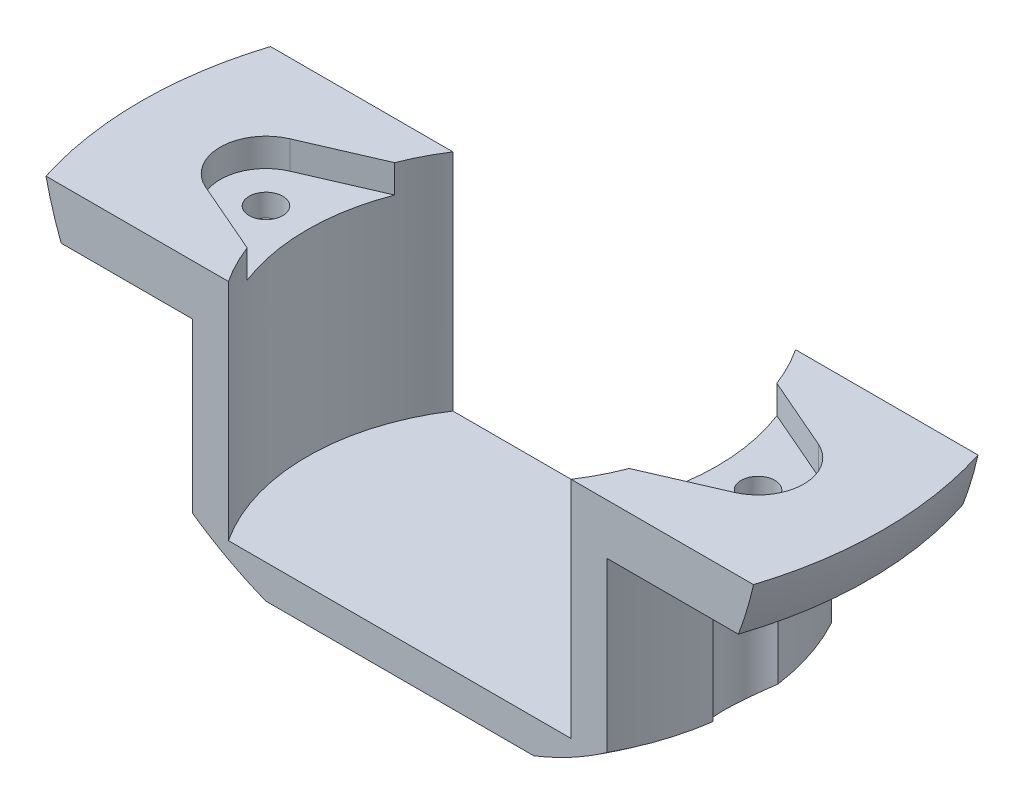
ISO-10303-21;
HEADER;
FILE_DESCRIPTION(('STEP AP214'),'2;1');
FILE_NAME('part.step','',(''),(''),'','','');
FILE_SCHEMA(('AUTOMOTIVE_DESIGN { 1 0 10303 214 1 1 1 1 }'));
ENDSEC;
DATA;
#1=APPLICATION_CONTEXT('core data for automotive mechanical design processes');
#2=APPLICATION_PROTOCOL_DEFINITION('international standard','automotive_design',2000,#1);
#3=PRODUCT_CONTEXT('',#1,'mechanical');
#4=PRODUCT('Part','Part','',(#3));
#5=PRODUCT_RELATED_PRODUCT_CATEGORY('part','',(#4));
#6=PRODUCT_DEFINITION_FORMATION('','',#4);
#7=PRODUCT_DEFINITION_CONTEXT('part definition',#1,'design');
#8=PRODUCT_DEFINITION('design','',#6,#7);
#9=PRODUCT_DEFINITION_SHAPE('','',#8);
#10=(LENGTH_UNIT() NAMED_UNIT(*) SI_UNIT(.MILLI.,.METRE.));
#11=(NAMED_UNIT(*) PLANE_ANGLE_UNIT() SI_UNIT($,.RADIAN.));
#12=(NAMED_UNIT(*) SI_UNIT($,.STERADIAN.) SOLID_ANGLE_UNIT());
#13=UNCERTAINTY_MEASURE_WITH_UNIT(LENGTH_MEASURE(1.E-05),#10,'distance_accuracy_value','');
#14=(GEOMETRIC_REPRESENTATION_CONTEXT(3) GLOBAL_UNCERTAINTY_ASSIGNED_CONTEXT((#13)) GLOBAL_UNIT_ASSIGNED_CONTEXT((#10,
#11,#12)) REPRESENTATION_CONTEXT('',''));
#15=CARTESIAN_POINT('',(0.,0.,0.));
#16=DIRECTION('',(0.,0.,1.));
#17=DIRECTION('',(1.,0.,0.));
#18=AXIS2_PLACEMENT_3D('',#15,#16,#17);
#19=CARTESIAN_POINT('',(0.,0.,0.));
#20=DIRECTION('',(0.,-1.,0.));
#21=DIRECTION('',(-1.,0.,0.));
#22=AXIS2_PLACEMENT_3D('',#19,#20,#21);
#23=SPHERICAL_SURFACE('',#22,33.8);
#24=CARTESIAN_POINT('',(0.,-26.484712571595,0.));
#25=DIRECTION('',(0.,1.,0.));
#26=DIRECTION('',(0.,0.,1.));
#27=AXIS2_PLACEMENT_3D('',#24,#25,#26);
#28=CIRCLE('',#27,21.);
#29=CARTESIAN_POINT('',(-18.4661853126194,-26.484712571595,10.));
#30=VERTEX_POINT('',#29);
#31=CARTESIAN_POINT('',(-20.8001003649635,-26.484712571595,2.89064435852027));
#32=VERTEX_POINT('',#31);
#33=EDGE_CURVE('E250',#30,#32,#28,.F.);
#34=ORIENTED_EDGE('',*,*,#33,.T.);
#35=CARTESIAN_POINT('',(-20.9039277655756,-26.398640244474,-2.92875352572247));
#36=CARTESIAN_POINT('',(-20.8063617033494,-26.4796550416653,-2.89487123831758));
#37=CARTESIAN_POINT('',(-20.7097097703274,-26.5595345143175,-2.85590288108901));
#38=CARTESIAN_POINT('',(-20.5188008915975,-26.7166307495117,-2.76727449327657));
#39=CARTESIAN_POINT('',(-20.4245495979902,-26.7938413579846,-2.71759144580597));
#40=CARTESIAN_POINT('',(-20.1455956378546,-27.0214069258355,-2.55117212351429));
#41=CARTESIAN_POINT('',(-19.9660755167148,-27.1665497162446,-2.4175249198258));
#42=CARTESIAN_POINT('',(-19.6865485623203,-27.3909914672109,-2.15536785942298));
#43=CARTESIAN_POINT('',(-19.5796487527699,-27.4763689077971,-2.03927630164801));
#44=CARTESIAN_POINT('',(-19.3817590168635,-27.633787752233,-1.78686258732234));
#45=CARTESIAN_POINT('',(-19.2907100746102,-27.7058786858668,-1.6506191260265));
#46=CARTESIAN_POINT('',(-19.1411604836875,-27.8239265774458,-1.38133664883738));
#47=CARTESIAN_POINT('',(-19.0798256845994,-27.8721820228791,-1.25088610477296));
#48=CARTESIAN_POINT('',(-18.97493201475,-27.9545539108106,-0.978681457344079));
#49=CARTESIAN_POINT('',(-18.9313759712339,-27.9886681045268,-0.836925560440767));
#50=CARTESIAN_POINT('',(-18.8646099295564,-28.0409094092167,-0.545063564498725));
#51=CARTESIAN_POINT('',(-18.8414972138931,-28.0589600820907,-0.394921116445173));
#52=CARTESIAN_POINT('',(-18.817638579733,-28.0775928367282,-0.0918207940655948));
#53=CARTESIAN_POINT('',(-18.8168822600703,-28.0781830418593,0.0611357378817071));
#54=CARTESIAN_POINT('',(-18.8368296880482,-28.0626055124787,0.351188572414799));
#55=CARTESIAN_POINT('',(-18.8556588949793,-28.047901590033,0.488500252309322));
#56=CARTESIAN_POINT('',(-18.9107953814761,-28.0047779988111,0.757309663218436));
#57=CARTESIAN_POINT('',(-18.947105026385,-27.9763564738535,0.888806604789135));
#58=CARTESIAN_POINT('',(-19.0363186895338,-27.9063690214966,1.14602144212512));
#59=CARTESIAN_POINT('',(-19.0895985229953,-27.8645052170937,1.27152614681683));
#60=CARTESIAN_POINT('',(-19.2099200956857,-27.7696911693222,1.51111038413956));
#61=CARTESIAN_POINT('',(-19.2769613288771,-27.7167413336104,1.62519033665492));
#62=CARTESIAN_POINT('',(-19.432087400059,-27.5938025322857,1.85527600084407));
#63=CARTESIAN_POINT('',(-19.521790448868,-27.5224790857897,1.96947085448558));
#64=CARTESIAN_POINT('',(-19.7124882227067,-27.3701802259617,2.18111118165925));
#65=CARTESIAN_POINT('',(-19.8135092517596,-27.28918229814,2.2785162435795));
#66=CARTESIAN_POINT('',(-20.0704904708395,-27.0821134127888,2.49577066645825));
#67=CARTESIAN_POINT('',(-20.2309445932343,-26.9519854144042,2.60641242709307));
#68=CARTESIAN_POINT('',(-20.5616047593516,-26.6817247526819,2.79294367724959));
#69=CARTESIAN_POINT('',(-20.731751600592,-26.541651759433,2.86902303178351));
#70=CARTESIAN_POINT('',(-20.9039277655756,-26.398640244474,2.92875352572248));
#71=B_SPLINE_CURVE_WITH_KNOTS('',3,(#35,#36,#37,#38,#39,#40,#41,#42,#43,#44,#45,#46,#47,#48,#49,
#50,#51,#52,#53,#54,#55,#56,#57,#58,#59,#60,#61,#62,#63,#64,#65,#66,#67,#68,#69,#70),
.UNSPECIFIED.,.F.,.F.,(4,2,2,2,2,2,2,2,2,2,2,2,2,2,2,2,2,4),(0.,0.393520569795233,
0.787895058794031,1.58213172818714,2.11851906290223,2.65286450258805,3.10700621508109,
3.56122011880086,4.01758401284611,4.47373558325256,4.88991880917637,5.30615836624046,
5.73234465175406,6.1585152682474,6.6420967009325,7.12682629564412,7.82655488459547,
8.52239167338341),.UNSPECIFIED.);
#72=CARTESIAN_POINT('',(-20.8001003649635,-26.484712571595,-2.89064435852028));
#73=VERTEX_POINT('',#72);
#74=EDGE_CURVE('E61',#73,#32,#71,.T.);
#75=ORIENTED_EDGE('',*,*,#74,.F.);
#76=CARTESIAN_POINT('',(-18.4661853126194,-26.484712571595,-10.));
#77=VERTEX_POINT('',#76);
#78=EDGE_CURVE('E230',#73,#77,#28,.F.);
#79=ORIENTED_EDGE('',*,*,#78,.T.);
#80=CARTESIAN_POINT('',(0.,0.,-10.));
#81=DIRECTION('',(0.,0.,-1.));
#82=DIRECTION('',(-1.,0.,0.));
#83=AXIS2_PLACEMENT_3D('',#80,#81,#82);
#84=CIRCLE('',#83,32.2868394241369);
#85=CARTESIAN_POINT('',(-11.9348229982685,-30.,-10.));
#86=VERTEX_POINT('',#85);
#87=EDGE_CURVE('E373',#77,#86,#84,.F.);
#88=ORIENTED_EDGE('',*,*,#87,.T.);
#89=CARTESIAN_POINT('',(0.,-30.,0.));
#90=DIRECTION('',(0.,1.,0.));
#91=DIRECTION('',(0.,0.,1.));
#92=AXIS2_PLACEMENT_3D('',#89,#90,#91);
#93=CIRCLE('',#92,15.5704848993215);
#94=CARTESIAN_POINT('',(-11.9348229982685,-30.,10.));
#95=VERTEX_POINT('',#94);
#96=EDGE_CURVE('E462',#95,#86,#93,.F.);
#97=ORIENTED_EDGE('',*,*,#96,.F.);
#98=CARTESIAN_POINT('',(0.,0.,10.));
#99=DIRECTION('',(0.,0.,1.));
#100=DIRECTION('',(1.,0.,0.));
#101=AXIS2_PLACEMENT_3D('',#98,#99,#100);
#102=CIRCLE('',#101,32.2868394241369);
#103=EDGE_CURVE('E368',#95,#30,#102,.F.);
#104=ORIENTED_EDGE('',*,*,#103,.T.);
#105=EDGE_LOOP('',(#34,#75,#79,#88,#97,#104));
#106=FACE_BOUND('',#105,.T.);
#107=ADVANCED_FACE('F38',(#106),#23,.T.);
#108=CARTESIAN_POINT('',(18.4661853126194,-26.484712571595,-10.));
#109=VERTEX_POINT('',#108);
#110=CARTESIAN_POINT('',(20.8001003649635,-26.484712571595,-2.89064435852029));
#111=VERTEX_POINT('',#110);
#112=EDGE_CURVE('E244',#109,#111,#28,.F.);
#113=ORIENTED_EDGE('',*,*,#112,.T.);
#114=CARTESIAN_POINT('',(20.9212849788197,-26.3842238189518,2.93471775584446));
#115=CARTESIAN_POINT('',(20.8236306011507,-26.4653562466392,2.90145175367052));
#116=CARTESIAN_POINT('',(20.7268671205073,-26.5453709674286,2.86310834780955));
#117=CARTESIAN_POINT('',(20.5356833862506,-26.702776151722,2.77575274688592));
#118=CARTESIAN_POINT('',(20.4412685796781,-26.7801606442884,2.7267179366121));
#119=CARTESIAN_POINT('',(20.1617225127619,-27.0083237624712,2.56228573988936));
#120=CARTESIAN_POINT('',(19.9816771180288,-27.153961408035,2.43001259441059));
#121=CARTESIAN_POINT('',(19.7004592017507,-27.379859765143,2.16971749934803));
#122=CARTESIAN_POINT('',(19.5925463697271,-27.4660800402281,2.05401708145196));
#123=CARTESIAN_POINT('',(19.3925798079542,-27.6252054510541,1.80217289227169));
#124=CARTESIAN_POINT('',(19.3004674561961,-27.6981598683244,1.66610835690374));
#125=CARTESIAN_POINT('',(19.1490505629728,-27.8177112602333,1.39711520839565));
#126=CARTESIAN_POINT('',(19.0868902013585,-27.8666265918021,1.26683156026589));
#127=CARTESIAN_POINT('',(18.9803215951353,-27.9503284466821,0.994786521771566));
#128=CARTESIAN_POINT('',(18.9359160709322,-27.9851128048508,0.853023376510676));
#129=CARTESIAN_POINT('',(18.8674683409806,-28.0386754901301,0.56093299923373));
#130=CARTESIAN_POINT('',(18.8435257131442,-28.0573755495345,0.410567645110321));
#131=CARTESIAN_POINT('',(18.8181006225993,-28.0772323396609,0.106828617014755));
#132=CARTESIAN_POINT('',(18.8166073470225,-28.0783975161671,-0.0465435730493309));
#133=CARTESIAN_POINT('',(18.8352691953377,-28.0638242773378,-0.337262902998077));
#134=CARTESIAN_POINT('',(18.8535008015624,-28.0495877974034,-0.47481683100432));
#135=CARTESIAN_POINT('',(18.9075223393941,-28.0073394377885,-0.744215715177445));
#136=CARTESIAN_POINT('',(18.9433145850548,-27.9793257426139,-0.87605991645242));
#137=CARTESIAN_POINT('',(19.0314826980442,-27.910166779017,-1.1337674965136));
#138=CARTESIAN_POINT('',(19.084201822893,-27.8687495508944,-1.25943881486395));
#139=CARTESIAN_POINT('',(19.2034484086963,-27.7747983926455,-1.49943995171104));
#140=CARTESIAN_POINT('',(19.2699750531608,-27.7222651198489,-1.61377044024279));
#141=CARTESIAN_POINT('',(19.423951383369,-27.6002635919525,-1.84429647599987));
#142=CARTESIAN_POINT('',(19.5130077259752,-27.5294716188944,-1.95871161745582));
#143=CARTESIAN_POINT('',(19.702460100221,-27.3782089118188,-2.17090124292018));
#144=CARTESIAN_POINT('',(19.8028833471268,-27.2977149175057,-2.26863432167143));
#145=CARTESIAN_POINT('',(20.0632584126155,-27.0879803189108,-2.49088300263681));
#146=CARTESIAN_POINT('',(20.2282928058839,-26.95416095744,-2.60510106860825));
#147=CARTESIAN_POINT('',(20.5686805005068,-26.6759329550891,-2.79674958144599));
#148=CARTESIAN_POINT('',(20.7439702868011,-26.5315883607771,-2.87438407174586));
#149=CARTESIAN_POINT('',(20.9212849788197,-26.3842238189518,-2.93471775584448));
#150=B_SPLINE_CURVE_WITH_KNOTS('',3,(#114,#115,#116,#117,#118,#119,#120,#121,#122,#123,#124,
#125,#126,#127,#128,#129,#130,#131,#132,#133,#134,#135,#136,#137,#138,#139,#140,#141,#142,#143,
#144,#145,#146,#147,#148,#149),.UNSPECIFIED.,.F.,.F.,(4,2,2,2,2,2,2,2,2,2,2,2,2,2,2,2,2,4),(0.,
0.393464759109579,0.787770019586551,1.58188290270471,2.12052892627023,2.65713111483241,
3.11247935855384,3.56789734426839,4.02551909800542,4.48292042834849,4.89942824961454,
5.31599097095659,5.74159995311048,6.16718377458476,6.64946060936992,7.13291758881426,
7.8529547084684,8.56892687376756),.UNSPECIFIED.);
#151=CARTESIAN_POINT('',(20.8001003649635,-26.484712571595,2.89064435852028));
#152=VERTEX_POINT('',#151);
#153=EDGE_CURVE('E470',#152,#111,#150,.T.);
#154=ORIENTED_EDGE('',*,*,#153,.F.);
#155=CARTESIAN_POINT('',(18.4661853126194,-26.484712571595,10.));
#156=VERTEX_POINT('',#155);
#157=EDGE_CURVE('E249',#152,#156,#28,.F.);
#158=ORIENTED_EDGE('',*,*,#157,.T.);
#159=CARTESIAN_POINT('',(11.9348229982685,-30.,10.));
#160=VERTEX_POINT('',#159);
#161=EDGE_CURVE('E367',#156,#160,#102,.F.);
#162=ORIENTED_EDGE('',*,*,#161,.T.);
#163=CARTESIAN_POINT('',(11.9348229982685,-30.,-10.));
#164=VERTEX_POINT('',#163);
#165=EDGE_CURVE('E454',#164,#160,#93,.F.);
#166=ORIENTED_EDGE('',*,*,#165,.F.);
#167=EDGE_CURVE('E374',#164,#109,#84,.F.);
#168=ORIENTED_EDGE('',*,*,#167,.T.);
#169=EDGE_LOOP('',(#113,#154,#158,#162,#166,#168));
#170=FACE_BOUND('',#169,.T.);
#171=ADVANCED_FACE('F412',(#170),#23,.T.);
#172=CARTESIAN_POINT('',(-21.92,-27.,0.));
#173=DIRECTION('',(0.,1.,0.));
#174=DIRECTION('',(0.,0.,1.));
#175=AXIS2_PLACEMENT_3D('',#172,#173,#174);
#176=CYLINDRICAL_SURFACE('',#175,1.5);
#177=CARTESIAN_POINT('',(-21.92,-9.5,0.));
#178=DIRECTION('',(0.,1.,0.));
#179=DIRECTION('',(0.,0.,1.));
#180=AXIS2_PLACEMENT_3D('',#177,#178,#179);
#181=CIRCLE('',#180,1.5);
#182=CARTESIAN_POINT('',(-21.92,-9.5,1.5));
#183=VERTEX_POINT('',#182);
#184=EDGE_CURVE('E282',#183,#183,#181,.T.);
#185=ORIENTED_EDGE('',*,*,#184,.T.);
#186=EDGE_LOOP('',(#185));
#187=FACE_BOUND('',#186,.T.);
#188=CARTESIAN_POINT('',(-21.92,-11.5,0.));
#189=DIRECTION('',(0.,1.,0.));
#190=DIRECTION('',(0.,0.,1.));
#191=AXIS2_PLACEMENT_3D('',#188,#189,#190);
#192=CIRCLE('',#191,1.5);
#193=CARTESIAN_POINT('',(-21.92,-11.5,1.5));
#194=VERTEX_POINT('',#193);
#195=EDGE_CURVE('E267',#194,#194,#192,.F.);
#196=ORIENTED_EDGE('',*,*,#195,.T.);
#197=EDGE_LOOP('',(#196));
#198=FACE_BOUND('',#197,.T.);
#199=ADVANCED_FACE('F416',(#187,#198),#176,.F.);
#200=CARTESIAN_POINT('',(21.92,-27.,0.));
#201=DIRECTION('',(0.,1.,0.));
#202=DIRECTION('',(0.,0.,1.));
#203=AXIS2_PLACEMENT_3D('',#200,#201,#202);
#204=CYLINDRICAL_SURFACE('',#203,1.5);
#205=CARTESIAN_POINT('',(21.92,-9.5,0.));
#206=DIRECTION('',(0.,1.,0.));
#207=DIRECTION('',(0.,0.,1.));
#208=AXIS2_PLACEMENT_3D('',#205,#206,#207);
#209=CIRCLE('',#208,1.5);
#210=CARTESIAN_POINT('',(21.92,-9.5,1.49999999999999));
#211=VERTEX_POINT('',#210);
#212=EDGE_CURVE('E286',#211,#211,#209,.T.);
#213=ORIENTED_EDGE('',*,*,#212,.T.);
#214=EDGE_LOOP('',(#213));
#215=FACE_BOUND('',#214,.T.);
#216=CARTESIAN_POINT('',(21.92,-11.5,0.));
#217=DIRECTION('',(0.,1.,0.));
#218=DIRECTION('',(0.,0.,1.));
#219=AXIS2_PLACEMENT_3D('',#216,#217,#218);
#220=CIRCLE('',#219,1.5);
#221=CARTESIAN_POINT('',(21.92,-11.5,1.49999999999999));
#222=VERTEX_POINT('',#221);
#223=EDGE_CURVE('E46',#222,#222,#220,.F.);
#224=ORIENTED_EDGE('',*,*,#223,.T.);
#225=EDGE_LOOP('',(#224));
#226=FACE_BOUND('',#225,.T.);
#227=ADVANCED_FACE('F395',(#215,#226),#204,.F.);
#228=CARTESIAN_POINT('',(0.,-33.8,0.));
#229=DIRECTION('',(0.,1.,0.));
#230=DIRECTION('',(0.,0.,1.));
#231=AXIS2_PLACEMENT_3D('',#228,#229,#230);
#232=CYLINDRICAL_SURFACE('',#231,21.);
#233=ORIENTED_EDGE('',*,*,#157,.F.);
#234=DIRECTION('',(0.,1.,0.));
#235=VECTOR('',#234,1.);
#236=CARTESIAN_POINT('',(20.8001003649635,-18.9923562857975,2.89064435852027));
#237=LINE('',#236,#235);
#238=CARTESIAN_POINT('',(20.8001003649635,-11.5,2.89064435852027));
#239=VERTEX_POINT('',#238);
#240=EDGE_CURVE('E466',#239,#152,#237,.F.);
#241=ORIENTED_EDGE('',*,*,#240,.F.);
#242=CARTESIAN_POINT('',(0.,-11.5,0.));
#243=DIRECTION('',(0.,1.,0.));
#244=DIRECTION('',(0.,0.,1.));
#245=AXIS2_PLACEMENT_3D('',#242,#243,#244);
#246=CIRCLE('',#245,21.);
#247=CARTESIAN_POINT('',(18.4661853126194,-11.5,10.));
#248=VERTEX_POINT('',#247);
#249=EDGE_CURVE('E239',#248,#239,#246,.T.);
#250=ORIENTED_EDGE('',*,*,#249,.F.);
#251=DIRECTION('',(0.,1.,0.));
#252=VECTOR('',#251,1.);
#253=CARTESIAN_POINT('',(18.4661853126194,-33.8,10.));
#254=LINE('',#253,#252);
#255=EDGE_CURVE('E256',#156,#248,#254,.T.);
#256=ORIENTED_EDGE('',*,*,#255,.F.);
#257=EDGE_LOOP('',(#233,#241,#250,#256));
#258=FACE_BOUND('',#257,.T.);
#259=ADVANCED_FACE('F441',(#258),#232,.T.);
#260=CARTESIAN_POINT('',(20.8001003649635,-11.5,-2.89064435852028));
#261=VERTEX_POINT('',#260);
#262=CARTESIAN_POINT('',(18.4661853126194,-11.5,-10.));
#263=VERTEX_POINT('',#262);
#264=EDGE_CURVE('E236',#261,#263,#246,.T.);
#265=ORIENTED_EDGE('',*,*,#264,.F.);
#266=DIRECTION('',(0.,1.,0.));
#267=VECTOR('',#266,1.);
#268=CARTESIAN_POINT('',(20.8001003649635,-18.9923562857975,-2.89064435852029));
#269=LINE('',#268,#267);
#270=EDGE_CURVE('E53',#111,#261,#269,.T.);
#271=ORIENTED_EDGE('',*,*,#270,.F.);
#272=ORIENTED_EDGE('',*,*,#112,.F.);
#273=DIRECTION('',(0.,1.,0.));
#274=VECTOR('',#273,1.);
#275=CARTESIAN_POINT('',(18.4661853126194,-33.8,-10.));
#276=LINE('',#275,#274);
#277=EDGE_CURVE('E248',#263,#109,#276,.F.);
#278=ORIENTED_EDGE('',*,*,#277,.F.);
#279=EDGE_LOOP('',(#265,#271,#272,#278));
#280=FACE_BOUND('',#279,.T.);
#281=ADVANCED_FACE('F490',(#280),#232,.T.);
#282=ORIENTED_EDGE('',*,*,#78,.F.);
#283=DIRECTION('',(0.,1.,0.));
#284=VECTOR('',#283,1.);
#285=CARTESIAN_POINT('',(-20.8001003649635,-18.9923562857975,-2.89064435852028));
#286=LINE('',#285,#284);
#287=CARTESIAN_POINT('',(-20.8001003649635,-11.5,-2.89064435852028));
#288=VERTEX_POINT('',#287);
#289=EDGE_CURVE('E217',#288,#73,#286,.F.);
#290=ORIENTED_EDGE('',*,*,#289,.F.);
#291=CARTESIAN_POINT('',(-18.4661853126194,-11.5,-10.));
#292=VERTEX_POINT('',#291);
#293=EDGE_CURVE('E228',#292,#288,#246,.T.);
#294=ORIENTED_EDGE('',*,*,#293,.F.);
#295=DIRECTION('',(0.,1.,0.));
#296=VECTOR('',#295,1.);
#297=CARTESIAN_POINT('',(-18.4661853126194,-33.8,-10.));
#298=LINE('',#297,#296);
#299=EDGE_CURVE('E265',#77,#292,#298,.T.);
#300=ORIENTED_EDGE('',*,*,#299,.F.);
#301=EDGE_LOOP('',(#282,#290,#294,#300));
#302=FACE_BOUND('',#301,.T.);
#303=ADVANCED_FACE('F226',(#302),#232,.T.);
#304=CARTESIAN_POINT('',(-20.8001003649635,-11.5,2.89064435852028));
#305=VERTEX_POINT('',#304);
#306=CARTESIAN_POINT('',(-18.4661853126194,-11.5,10.));
#307=VERTEX_POINT('',#306);
#308=EDGE_CURVE('E237',#305,#307,#246,.T.);
#309=ORIENTED_EDGE('',*,*,#308,.F.);
#310=DIRECTION('',(0.,1.,0.));
#311=VECTOR('',#310,1.);
#312=CARTESIAN_POINT('',(-20.8001003649635,-18.9923562857975,2.89064435852028));
#313=LINE('',#312,#311);
#314=EDGE_CURVE('E218',#32,#305,#313,.T.);
#315=ORIENTED_EDGE('',*,*,#314,.F.);
#316=ORIENTED_EDGE('',*,*,#33,.F.);
#317=DIRECTION('',(0.,1.,0.));
#318=VECTOR('',#317,1.);
#319=CARTESIAN_POINT('',(-18.4661853126194,-33.8,10.));
#320=LINE('',#319,#318);
#321=EDGE_CURVE('E258',#307,#30,#320,.F.);
#322=ORIENTED_EDGE('',*,*,#321,.F.);
#323=EDGE_LOOP('',(#309,#315,#316,#322));
#324=FACE_BOUND('',#323,.T.);
#325=ADVANCED_FACE('F432',(#324),#232,.T.);
#326=CARTESIAN_POINT('',(0.,-11.5,0.));
#327=DIRECTION('',(0.,1.,0.));
#328=DIRECTION('',(0.,0.,1.));
#329=AXIS2_PLACEMENT_3D('',#326,#327,#328);
#330=CIRCLE('',#329,31.7834862782546);
#331=CARTESIAN_POINT('',(-30.1693553129662,-11.5,10.));
#332=VERTEX_POINT('',#331);
#333=CARTESIAN_POINT('',(-30.1693553129662,-11.5,-10.));
#334=VERTEX_POINT('',#333);
#335=EDGE_CURVE('E279',#332,#334,#330,.F.);
#336=ORIENTED_EDGE('',*,*,#335,.F.);
#337=CARTESIAN_POINT('',(-31.518883228947,-7.,10.));
#338=VERTEX_POINT('',#337);
#339=EDGE_CURVE('E339',#332,#338,#102,.F.);
#340=ORIENTED_EDGE('',*,*,#339,.T.);
#341=CARTESIAN_POINT('',(0.,-7.,0.));
#342=DIRECTION('',(0.,1.,0.));
#343=DIRECTION('',(0.,0.,1.));
#344=AXIS2_PLACEMENT_3D('',#341,#342,#343);
#345=CIRCLE('',#344,33.0672042967046);
#346=CARTESIAN_POINT('',(-33.0672042967046,-7.,0.));
#347=VERTEX_POINT('',#346);
#348=EDGE_CURVE('E375',#338,#347,#345,.F.);
#349=ORIENTED_EDGE('',*,*,#348,.T.);
#350=CARTESIAN_POINT('',(-31.5188832289471,-7.,-10.));
#351=VERTEX_POINT('',#350);
#352=EDGE_CURVE('E379',#347,#351,#345,.F.);
#353=ORIENTED_EDGE('',*,*,#352,.T.);
#354=EDGE_CURVE('E369',#351,#334,#84,.F.);
#355=ORIENTED_EDGE('',*,*,#354,.T.);
#356=EDGE_LOOP('',(#336,#340,#349,#353,#355));
#357=FACE_BOUND('',#356,.T.);
#358=ADVANCED_FACE('F417',(#357),#23,.T.);
#359=CARTESIAN_POINT('',(0.,-9.5,0.));
#360=DIRECTION('',(0.,1.,0.));
#361=DIRECTION('',(0.,0.,1.));
#362=AXIS2_PLACEMENT_3D('',#359,#360,#361);
#363=PLANE('',#362);
#364=ORIENTED_EDGE('',*,*,#212,.F.);
#365=EDGE_LOOP('',(#364));
#366=FACE_BOUND('',#365,.T.);
#367=CARTESIAN_POINT('',(0.,-9.5,0.));
#368=DIRECTION('',(0.,1.,0.));
#369=DIRECTION('',(0.,0.,1.));
#370=AXIS2_PLACEMENT_3D('',#367,#368,#369);
#371=CIRCLE('',#370,18.25);
#372=CARTESIAN_POINT('',(17.0257322293628,-9.5,6.57167726338077));
#373=VERTEX_POINT('',#372);
#374=CARTESIAN_POINT('',(17.0257322293628,-9.5,-6.57167726338076));
#375=VERTEX_POINT('',#374);
#376=EDGE_CURVE('E389',#373,#375,#371,.T.);
#377=ORIENTED_EDGE('',*,*,#376,.F.);
#378=DIRECTION('',(-0.917338230246221,0.,0.398108743095064));
#379=VECTOR('',#378,1.);
#380=CARTESIAN_POINT('',(5.09839699535365,-9.5,11.7479320862179));
#381=LINE('',#380,#379);
#382=CARTESIAN_POINT('',(23.5442836718279,-9.5,3.74273997940458));
#383=VERTEX_POINT('',#382);
#384=EDGE_CURVE('E296',#383,#373,#381,.T.);
#385=ORIENTED_EDGE('',*,*,#384,.F.);
#386=CARTESIAN_POINT('',(21.92,-9.5,0.));
#387=DIRECTION('',(0.,1.,0.));
#388=DIRECTION('',(0.,0.,1.));
#389=AXIS2_PLACEMENT_3D('',#386,#387,#388);
#390=CIRCLE('',#389,4.08);
#391=CARTESIAN_POINT('',(23.5442836718279,-9.5,-3.74273997940458));
#392=VERTEX_POINT('',#391);
#393=EDGE_CURVE('E299',#392,#383,#390,.F.);
#394=ORIENTED_EDGE('',*,*,#393,.F.);
#395=DIRECTION('',(0.917338230246221,0.,0.398108743095064));
#396=VECTOR('',#395,1.);
#397=CARTESIAN_POINT('',(5.09839699535365,-9.5,-11.7479320862179));
#398=LINE('',#397,#396);
#399=EDGE_CURVE('E302',#375,#392,#398,.T.);
#400=ORIENTED_EDGE('',*,*,#399,.F.);
#401=EDGE_LOOP('',(#377,#385,#394,#400));
#402=FACE_BOUND('',#401,.T.);
#403=ADVANCED_FACE('F428',(#366,#402),#363,.T.);
#404=CARTESIAN_POINT('',(0.,-7.,0.));
#405=DIRECTION('',(0.,1.,0.));
#406=DIRECTION('',(0.,0.,1.));
#407=AXIS2_PLACEMENT_3D('',#404,#405,#406);
#408=PLANE('',#407);
#409=CARTESIAN_POINT('',(0.,-7.,0.));
#410=DIRECTION('',(0.,1.,0.));
#411=DIRECTION('',(0.,0.,1.));
#412=AXIS2_PLACEMENT_3D('',#409,#410,#411);
#413=CIRCLE('',#412,18.25);
#414=CARTESIAN_POINT('',(-17.0257322293628,-7.,6.57167726338077));
#415=VERTEX_POINT('',#414);
#416=CARTESIAN_POINT('',(-15.266384640772,-7.,10.));
#417=VERTEX_POINT('',#416);
#418=EDGE_CURVE('E300',#415,#417,#413,.T.);
#419=ORIENTED_EDGE('',*,*,#418,.F.);
#420=DIRECTION('',(0.917338230246221,0.,0.398108743095064));
#421=VECTOR('',#420,1.);
#422=CARTESIAN_POINT('',(-5.09839699535365,-7.,11.7479320862179));
#423=LINE('',#422,#421);
#424=CARTESIAN_POINT('',(-23.5442836718279,-7.,3.74273997940458));
#425=VERTEX_POINT('',#424);
#426=EDGE_CURVE('E334',#425,#415,#423,.T.);
#427=ORIENTED_EDGE('',*,*,#426,.F.);
#428=CARTESIAN_POINT('',(-21.92,-7.,0.));
#429=DIRECTION('',(0.,1.,0.));
#430=DIRECTION('',(0.,0.,1.));
#431=AXIS2_PLACEMENT_3D('',#428,#429,#430);
#432=CIRCLE('',#431,4.08);
#433=CARTESIAN_POINT('',(-23.5442836718279,-7.,-3.74273997940458));
#434=VERTEX_POINT('',#433);
#435=EDGE_CURVE('E331',#434,#425,#432,.T.);
#436=ORIENTED_EDGE('',*,*,#435,.F.);
#437=DIRECTION('',(0.917338230246221,0.,-0.398108743095064));
#438=VECTOR('',#437,1.);
#439=CARTESIAN_POINT('',(-5.09839699535365,-7.,-11.7479320862179));
#440=LINE('',#439,#438);
#441=CARTESIAN_POINT('',(-17.0257322293628,-7.,-6.57167726338077));
#442=VERTEX_POINT('',#441);
#443=EDGE_CURVE('E328',#434,#442,#440,.T.);
#444=ORIENTED_EDGE('',*,*,#443,.T.);
#445=CARTESIAN_POINT('',(0.,-7.,0.));
#446=DIRECTION('',(0.,1.,0.));
#447=DIRECTION('',(0.,0.,1.));
#448=AXIS2_PLACEMENT_3D('',#445,#446,#447);
#449=CIRCLE('',#448,18.25);
#450=CARTESIAN_POINT('',(-15.266384640772,-7.,-10.));
#451=VERTEX_POINT('',#450);
#452=EDGE_CURVE('E327',#451,#442,#449,.T.);
#453=ORIENTED_EDGE('',*,*,#452,.F.);
#454=DIRECTION('',(-1.,0.,0.));
#455=VECTOR('',#454,1.);
#456=CARTESIAN_POINT('',(0.,-7.,-10.));
#457=LINE('',#456,#455);
#458=EDGE_CURVE('E383',#451,#351,#457,.T.);
#459=ORIENTED_EDGE('',*,*,#458,.T.);
#460=ORIENTED_EDGE('',*,*,#352,.F.);
#461=ORIENTED_EDGE('',*,*,#348,.F.);
#462=DIRECTION('',(1.,0.,0.));
#463=VECTOR('',#462,1.);
#464=CARTESIAN_POINT('',(0.,-7.,10.));
#465=LINE('',#464,#463);
#466=EDGE_CURVE('E380',#338,#417,#465,.T.);
#467=ORIENTED_EDGE('',*,*,#466,.T.);
#468=EDGE_LOOP('',(#419,#427,#436,#444,#453,#459,#460,#461,#467));
#469=FACE_BOUND('',#468,.T.);
#470=ADVANCED_FACE('F420',(#469),#408,.T.);
#471=CARTESIAN_POINT('',(30.1693553129662,-11.5,-10.));
#472=VERTEX_POINT('',#471);
#473=CARTESIAN_POINT('',(30.1693553129662,-11.5,10.));
#474=VERTEX_POINT('',#473);
#475=EDGE_CURVE('E276',#472,#474,#330,.F.);
#476=ORIENTED_EDGE('',*,*,#475,.F.);
#477=CARTESIAN_POINT('',(31.5188832289471,-7.,-10.));
#478=VERTEX_POINT('',#477);
#479=EDGE_CURVE('E366',#472,#478,#84,.F.);
#480=ORIENTED_EDGE('',*,*,#479,.T.);
#481=CARTESIAN_POINT('',(33.0672042967046,-7.,0.));
#482=VERTEX_POINT('',#481);
#483=EDGE_CURVE('E543',#478,#482,#345,.F.);
#484=ORIENTED_EDGE('',*,*,#483,.T.);
#485=CARTESIAN_POINT('',(31.5188832289471,-7.,10.));
#486=VERTEX_POINT('',#485);
#487=EDGE_CURVE('E372',#482,#486,#345,.F.);
#488=ORIENTED_EDGE('',*,*,#487,.T.);
#489=EDGE_CURVE('E363',#486,#474,#102,.F.);
#490=ORIENTED_EDGE('',*,*,#489,.T.);
#491=EDGE_LOOP('',(#476,#480,#484,#488,#490));
#492=FACE_BOUND('',#491,.T.);
#493=ADVANCED_FACE('F40',(#492),#23,.T.);
#494=CARTESIAN_POINT('',(15.266384640772,-7.,10.));
#495=VERTEX_POINT('',#494);
#496=CARTESIAN_POINT('',(17.0257322293628,-7.,6.57167726338077));
#497=VERTEX_POINT('',#496);
#498=EDGE_CURVE('E295',#495,#497,#413,.T.);
#499=ORIENTED_EDGE('',*,*,#498,.F.);
#500=EDGE_CURVE('E378',#495,#486,#465,.T.);
#501=ORIENTED_EDGE('',*,*,#500,.T.);
#502=ORIENTED_EDGE('',*,*,#487,.F.);
#503=ORIENTED_EDGE('',*,*,#483,.F.);
#504=CARTESIAN_POINT('',(15.266384640772,-7.,-10.));
#505=VERTEX_POINT('',#504);
#506=EDGE_CURVE('E384',#478,#505,#457,.T.);
#507=ORIENTED_EDGE('',*,*,#506,.T.);
#508=CARTESIAN_POINT('',(17.0257322293628,-7.,-6.57167726338076));
#509=VERTEX_POINT('',#508);
#510=EDGE_CURVE('E325',#509,#505,#449,.T.);
#511=ORIENTED_EDGE('',*,*,#510,.F.);
#512=DIRECTION('',(0.917338230246221,0.,0.398108743095064));
#513=VECTOR('',#512,1.);
#514=CARTESIAN_POINT('',(5.09839699535365,-7.,-11.7479320862179));
#515=LINE('',#514,#513);
#516=CARTESIAN_POINT('',(23.5442836718279,-7.,-3.74273997940458));
#517=VERTEX_POINT('',#516);
#518=EDGE_CURVE('E322',#509,#517,#515,.T.);
#519=ORIENTED_EDGE('',*,*,#518,.T.);
#520=CARTESIAN_POINT('',(21.92,-7.,0.));
#521=DIRECTION('',(0.,1.,0.));
#522=DIRECTION('',(0.,0.,1.));
#523=AXIS2_PLACEMENT_3D('',#520,#521,#522);
#524=CIRCLE('',#523,4.08);
#525=CARTESIAN_POINT('',(23.5442836718279,-7.,3.74273997940458));
#526=VERTEX_POINT('',#525);
#527=EDGE_CURVE('E319',#517,#526,#524,.F.);
#528=ORIENTED_EDGE('',*,*,#527,.T.);
#529=DIRECTION('',(-0.917338230246221,0.,0.398108743095064));
#530=VECTOR('',#529,1.);
#531=CARTESIAN_POINT('',(5.09839699535365,-7.,11.7479320862179));
#532=LINE('',#531,#530);
#533=EDGE_CURVE('E316',#526,#497,#532,.T.);
#534=ORIENTED_EDGE('',*,*,#533,.T.);
#535=EDGE_LOOP('',(#499,#501,#502,#503,#507,#511,#519,#528,#534));
#536=FACE_BOUND('',#535,.T.);
#537=ADVANCED_FACE('F419',(#536),#408,.T.);
#538=CARTESIAN_POINT('',(33.0672042967046,-33.8,10.));
#539=DIRECTION('',(0.,0.,1.));
#540=DIRECTION('',(1.,0.,0.));
#541=AXIS2_PLACEMENT_3D('',#538,#539,#540);
#542=PLANE('',#541);
#543=DIRECTION('',(-1.,0.,0.));
#544=VECTOR('',#543,1.);
#545=CARTESIAN_POINT('',(33.0672042967046,-30.,10.));
#546=LINE('',#545,#544);
#547=EDGE_CURVE('E240',#160,#95,#546,.T.);
#548=ORIENTED_EDGE('',*,*,#547,.F.);
#549=ORIENTED_EDGE('',*,*,#161,.F.);
#550=ORIENTED_EDGE('',*,*,#255,.T.);
#551=DIRECTION('',(-1.,0.,0.));
#552=VECTOR('',#551,1.);
#553=CARTESIAN_POINT('',(33.0672042967046,-11.5,10.));
#554=LINE('',#553,#552);
#555=EDGE_CURVE('E278',#474,#248,#554,.T.);
#556=ORIENTED_EDGE('',*,*,#555,.F.);
#557=ORIENTED_EDGE('',*,*,#489,.F.);
#558=ORIENTED_EDGE('',*,*,#500,.F.);
#559=DIRECTION('',(0.,1.,0.));
#560=VECTOR('',#559,1.);
#561=CARTESIAN_POINT('',(15.266384640772,-9.5,10.));
#562=LINE('',#561,#560);
#563=CARTESIAN_POINT('',(15.266384640772,-27.,10.));
#564=VERTEX_POINT('',#563);
#565=EDGE_CURVE('E337',#564,#495,#562,.T.);
#566=ORIENTED_EDGE('',*,*,#565,.F.);
#567=DIRECTION('',(-1.,0.,0.));
#568=VECTOR('',#567,1.);
#569=CARTESIAN_POINT('',(33.0672042967046,-27.,10.));
#570=LINE('',#569,#568);
#571=CARTESIAN_POINT('',(-15.266384640772,-27.,10.));
#572=VERTEX_POINT('',#571);
#573=EDGE_CURVE('E292',#564,#572,#570,.T.);
#574=ORIENTED_EDGE('',*,*,#573,.T.);
#575=DIRECTION('',(0.,1.,0.));
#576=VECTOR('',#575,1.);
#577=CARTESIAN_POINT('',(-15.266384640772,-9.5,10.));
#578=LINE('',#577,#576);
#579=EDGE_CURVE('E340',#572,#417,#578,.T.);
#580=ORIENTED_EDGE('',*,*,#579,.T.);
#581=ORIENTED_EDGE('',*,*,#466,.F.);
#582=ORIENTED_EDGE('',*,*,#339,.F.);
#583=EDGE_CURVE('E281',#307,#332,#554,.T.);
#584=ORIENTED_EDGE('',*,*,#583,.F.);
#585=ORIENTED_EDGE('',*,*,#321,.T.);
#586=ORIENTED_EDGE('',*,*,#103,.F.);
#587=EDGE_LOOP('',(#548,#549,#550,#556,#557,#558,#566,#574,#580,#581,#582,#584,#585,#586));
#588=FACE_BOUND('',#587,.T.);
#589=ADVANCED_FACE('F426',(#588),#542,.T.);
#590=CARTESIAN_POINT('',(33.0672042967046,-33.8,-10.));
#591=DIRECTION('',(0.,0.,-1.));
#592=DIRECTION('',(-1.,0.,0.));
#593=AXIS2_PLACEMENT_3D('',#590,#591,#592);
#594=PLANE('',#593);
#595=DIRECTION('',(1.,0.,0.));
#596=VECTOR('',#595,1.);
#597=CARTESIAN_POINT('',(33.0672042967046,-30.,-10.));
#598=LINE('',#597,#596);
#599=EDGE_CURVE('E12',#86,#164,#598,.T.);
#600=ORIENTED_EDGE('',*,*,#599,.F.);
#601=ORIENTED_EDGE('',*,*,#87,.F.);
#602=ORIENTED_EDGE('',*,*,#299,.T.);
#603=DIRECTION('',(1.,0.,0.));
#604=VECTOR('',#603,1.);
#605=CARTESIAN_POINT('',(33.0672042967046,-11.5,-10.));
#606=LINE('',#605,#604);
#607=EDGE_CURVE('E235',#334,#292,#606,.T.);
#608=ORIENTED_EDGE('',*,*,#607,.F.);
#609=ORIENTED_EDGE('',*,*,#354,.F.);
#610=ORIENTED_EDGE('',*,*,#458,.F.);
#611=DIRECTION('',(0.,1.,0.));
#612=VECTOR('',#611,1.);
#613=CARTESIAN_POINT('',(-15.266384640772,-9.5,-10.));
#614=LINE('',#613,#612);
#615=CARTESIAN_POINT('',(-15.266384640772,-27.,-10.));
#616=VERTEX_POINT('',#615);
#617=EDGE_CURVE('E351',#616,#451,#614,.T.);
#618=ORIENTED_EDGE('',*,*,#617,.F.);
#619=DIRECTION('',(1.,0.,0.));
#620=VECTOR('',#619,1.);
#621=CARTESIAN_POINT('',(33.0672042967046,-27.,-10.));
#622=LINE('',#621,#620);
#623=CARTESIAN_POINT('',(15.266384640772,-27.,-10.));
#624=VERTEX_POINT('',#623);
#625=EDGE_CURVE('E390',#616,#624,#622,.T.);
#626=ORIENTED_EDGE('',*,*,#625,.T.);
#627=DIRECTION('',(0.,1.,0.));
#628=VECTOR('',#627,1.);
#629=CARTESIAN_POINT('',(15.266384640772,-9.5,-10.));
#630=LINE('',#629,#628);
#631=EDGE_CURVE('E353',#624,#505,#630,.T.);
#632=ORIENTED_EDGE('',*,*,#631,.T.);
#633=ORIENTED_EDGE('',*,*,#506,.F.);
#634=ORIENTED_EDGE('',*,*,#479,.F.);
#635=EDGE_CURVE('E272',#263,#472,#606,.T.);
#636=ORIENTED_EDGE('',*,*,#635,.F.);
#637=ORIENTED_EDGE('',*,*,#277,.T.);
#638=ORIENTED_EDGE('',*,*,#167,.F.);
#639=EDGE_LOOP('',(#600,#601,#602,#608,#609,#610,#618,#626,#632,#633,#634,#636,#637,#638));
#640=FACE_BOUND('',#639,.T.);
#641=ADVANCED_FACE('F505',(#640),#594,.T.);
#642=CARTESIAN_POINT('',(0.,-9.5,0.));
#643=DIRECTION('',(0.,1.,0.));
#644=DIRECTION('',(0.,0.,1.));
#645=AXIS2_PLACEMENT_3D('',#642,#643,#644);
#646=CYLINDRICAL_SURFACE('',#645,18.25);
#647=ORIENTED_EDGE('',*,*,#498,.T.);
#648=DIRECTION('',(0.,1.,0.));
#649=VECTOR('',#648,1.);
#650=CARTESIAN_POINT('',(17.0257322293628,-9.5,6.57167726338077));
#651=LINE('',#650,#649);
#652=EDGE_CURVE('E313',#373,#497,#651,.T.);
#653=ORIENTED_EDGE('',*,*,#652,.F.);
#654=ORIENTED_EDGE('',*,*,#376,.T.);
#655=DIRECTION('',(0.,1.,0.));
#656=VECTOR('',#655,1.);
#657=CARTESIAN_POINT('',(17.0257322293628,-9.5,-6.57167726338076));
#658=LINE('',#657,#656);
#659=EDGE_CURVE('E356',#375,#509,#658,.T.);
#660=ORIENTED_EDGE('',*,*,#659,.T.);
#661=ORIENTED_EDGE('',*,*,#510,.T.);
#662=ORIENTED_EDGE('',*,*,#631,.F.);
#663=CARTESIAN_POINT('',(0.,-27.,0.));
#664=DIRECTION('',(0.,1.,0.));
#665=DIRECTION('',(0.,0.,1.));
#666=AXIS2_PLACEMENT_3D('',#663,#664,#665);
#667=CIRCLE('',#666,18.25);
#668=EDGE_CURVE('E289',#564,#624,#667,.T.);
#669=ORIENTED_EDGE('',*,*,#668,.F.);
#670=ORIENTED_EDGE('',*,*,#565,.T.);
#671=EDGE_LOOP('',(#647,#653,#654,#660,#661,#662,#669,#670));
#672=FACE_BOUND('',#671,.T.);
#673=ADVANCED_FACE('F517',(#672),#646,.F.);
#674=ORIENTED_EDGE('',*,*,#418,.T.);
#675=ORIENTED_EDGE('',*,*,#579,.F.);
#676=EDGE_CURVE('E285',#616,#572,#667,.T.);
#677=ORIENTED_EDGE('',*,*,#676,.F.);
#678=ORIENTED_EDGE('',*,*,#617,.T.);
#679=ORIENTED_EDGE('',*,*,#452,.T.);
#680=DIRECTION('',(0.,1.,0.));
#681=VECTOR('',#680,1.);
#682=CARTESIAN_POINT('',(-17.0257322293628,-9.5,-6.57167726338077));
#683=LINE('',#682,#681);
#684=CARTESIAN_POINT('',(-17.0257322293628,-9.5,-6.57167726338077));
#685=VERTEX_POINT('',#684);
#686=EDGE_CURVE('E349',#685,#442,#683,.T.);
#687=ORIENTED_EDGE('',*,*,#686,.F.);
#688=CARTESIAN_POINT('',(-17.0257322293628,-9.5,6.57167726338077));
#689=VERTEX_POINT('',#688);
#690=EDGE_CURVE('E387',#685,#689,#371,.T.);
#691=ORIENTED_EDGE('',*,*,#690,.T.);
#692=DIRECTION('',(0.,1.,0.));
#693=VECTOR('',#692,1.);
#694=CARTESIAN_POINT('',(-17.0257322293628,-9.5,6.57167726338077));
#695=LINE('',#694,#693);
#696=EDGE_CURVE('E343',#689,#415,#695,.T.);
#697=ORIENTED_EDGE('',*,*,#696,.T.);
#698=EDGE_LOOP('',(#674,#675,#677,#678,#679,#687,#691,#697));
#699=FACE_BOUND('',#698,.T.);
#700=ADVANCED_FACE('F526',(#699),#646,.F.);
#701=CARTESIAN_POINT('',(-5.09839699535365,-9.5,11.7479320862179));
#702=DIRECTION('',(-0.398108743095063,0.,0.917338230246221));
#703=DIRECTION('',(0.917338230246221,0.,0.398108743095063));
#704=AXIS2_PLACEMENT_3D('',#701,#702,#703);
#705=PLANE('',#704);
#706=ORIENTED_EDGE('',*,*,#426,.T.);
#707=ORIENTED_EDGE('',*,*,#696,.F.);
#708=DIRECTION('',(0.917338230246221,0.,0.398108743095064));
#709=VECTOR('',#708,1.);
#710=CARTESIAN_POINT('',(-5.09839699535365,-9.5,11.7479320862179));
#711=LINE('',#710,#709);
#712=CARTESIAN_POINT('',(-23.5442836718279,-9.5,3.74273997940458));
#713=VERTEX_POINT('',#712);
#714=EDGE_CURVE('E310',#713,#689,#711,.T.);
#715=ORIENTED_EDGE('',*,*,#714,.F.);
#716=DIRECTION('',(0.,1.,0.));
#717=VECTOR('',#716,1.);
#718=CARTESIAN_POINT('',(-23.5442836718279,-9.5,3.74273997940458));
#719=LINE('',#718,#717);
#720=EDGE_CURVE('E345',#713,#425,#719,.T.);
#721=ORIENTED_EDGE('',*,*,#720,.T.);
#722=EDGE_LOOP('',(#706,#707,#715,#721));
#723=FACE_BOUND('',#722,.T.);
#724=ADVANCED_FACE('F539',(#723),#705,.F.);
#725=CARTESIAN_POINT('',(-21.92,-9.5,0.));
#726=DIRECTION('',(0.,1.,0.));
#727=DIRECTION('',(0.,0.,1.));
#728=AXIS2_PLACEMENT_3D('',#725,#726,#727);
#729=CYLINDRICAL_SURFACE('',#728,4.08);
#730=ORIENTED_EDGE('',*,*,#435,.T.);
#731=ORIENTED_EDGE('',*,*,#720,.F.);
#732=CARTESIAN_POINT('',(-21.92,-9.5,0.));
#733=DIRECTION('',(0.,1.,0.));
#734=DIRECTION('',(0.,0.,1.));
#735=AXIS2_PLACEMENT_3D('',#732,#733,#734);
#736=CIRCLE('',#735,4.08);
#737=CARTESIAN_POINT('',(-23.5442836718279,-9.5,-3.74273997940458));
#738=VERTEX_POINT('',#737);
#739=EDGE_CURVE('E307',#738,#713,#736,.T.);
#740=ORIENTED_EDGE('',*,*,#739,.F.);
#741=DIRECTION('',(0.,1.,0.));
#742=VECTOR('',#741,1.);
#743=CARTESIAN_POINT('',(-23.5442836718279,-9.5,-3.74273997940458));
#744=LINE('',#743,#742);
#745=EDGE_CURVE('E347',#738,#434,#744,.T.);
#746=ORIENTED_EDGE('',*,*,#745,.T.);
#747=EDGE_LOOP('',(#730,#731,#740,#746));
#748=FACE_BOUND('',#747,.T.);
#749=ADVANCED_FACE('F542',(#748),#729,.F.);
#750=CARTESIAN_POINT('',(-5.09839699535365,-9.5,-11.7479320862179));
#751=DIRECTION('',(0.398108743095063,0.,0.917338230246221));
#752=DIRECTION('',(0.917338230246221,0.,-0.398108743095063));
#753=AXIS2_PLACEMENT_3D('',#750,#751,#752);
#754=PLANE('',#753);
#755=ORIENTED_EDGE('',*,*,#443,.F.);
#756=ORIENTED_EDGE('',*,*,#745,.F.);
#757=DIRECTION('',(0.917338230246221,0.,-0.398108743095064));
#758=VECTOR('',#757,1.);
#759=CARTESIAN_POINT('',(-5.09839699535365,-9.5,-11.7479320862179));
#760=LINE('',#759,#758);
#761=EDGE_CURVE('E304',#738,#685,#760,.T.);
#762=ORIENTED_EDGE('',*,*,#761,.T.);
#763=ORIENTED_EDGE('',*,*,#686,.T.);
#764=EDGE_LOOP('',(#755,#756,#762,#763));
#765=FACE_BOUND('',#764,.T.);
#766=ADVANCED_FACE('F533',(#765),#754,.T.);
#767=CARTESIAN_POINT('',(5.09839699535365,-9.5,-11.7479320862179));
#768=DIRECTION('',(-0.398108743095064,0.,0.917338230246221));
#769=DIRECTION('',(0.917338230246221,0.,0.398108743095064));
#770=AXIS2_PLACEMENT_3D('',#767,#768,#769);
#771=PLANE('',#770);
#772=ORIENTED_EDGE('',*,*,#518,.F.);
#773=ORIENTED_EDGE('',*,*,#659,.F.);
#774=ORIENTED_EDGE('',*,*,#399,.T.);
#775=DIRECTION('',(0.,1.,0.));
#776=VECTOR('',#775,1.);
#777=CARTESIAN_POINT('',(23.5442836718279,-9.5,-3.74273997940458));
#778=LINE('',#777,#776);
#779=EDGE_CURVE('E358',#392,#517,#778,.T.);
#780=ORIENTED_EDGE('',*,*,#779,.T.);
#781=EDGE_LOOP('',(#772,#773,#774,#780));
#782=FACE_BOUND('',#781,.T.);
#783=ADVANCED_FACE('F549',(#782),#771,.T.);
#784=CARTESIAN_POINT('',(21.92,-9.5,0.));
#785=DIRECTION('',(0.,1.,0.));
#786=DIRECTION('',(0.,0.,1.));
#787=AXIS2_PLACEMENT_3D('',#784,#785,#786);
#788=CYLINDRICAL_SURFACE('',#787,4.08);
#789=ORIENTED_EDGE('',*,*,#527,.F.);
#790=ORIENTED_EDGE('',*,*,#779,.F.);
#791=ORIENTED_EDGE('',*,*,#393,.T.);
#792=DIRECTION('',(0.,1.,0.));
#793=VECTOR('',#792,1.);
#794=CARTESIAN_POINT('',(23.5442836718279,-9.5,3.74273997940458));
#795=LINE('',#794,#793);
#796=EDGE_CURVE('E360',#383,#526,#795,.T.);
#797=ORIENTED_EDGE('',*,*,#796,.T.);
#798=EDGE_LOOP('',(#789,#790,#791,#797));
#799=FACE_BOUND('',#798,.T.);
#800=ADVANCED_FACE('F554',(#799),#788,.F.);
#801=CARTESIAN_POINT('',(5.09839699535365,-9.5,11.7479320862179));
#802=DIRECTION('',(-0.398108743095064,0.,-0.917338230246221));
#803=DIRECTION('',(-0.917338230246221,0.,0.398108743095064));
#804=AXIS2_PLACEMENT_3D('',#801,#802,#803);
#805=PLANE('',#804);
#806=ORIENTED_EDGE('',*,*,#533,.F.);
#807=ORIENTED_EDGE('',*,*,#796,.F.);
#808=ORIENTED_EDGE('',*,*,#384,.T.);
#809=ORIENTED_EDGE('',*,*,#652,.T.);
#810=EDGE_LOOP('',(#806,#807,#808,#809));
#811=FACE_BOUND('',#810,.T.);
#812=ADVANCED_FACE('F558',(#811),#805,.T.);
#813=ORIENTED_EDGE('',*,*,#184,.F.);
#814=EDGE_LOOP('',(#813));
#815=FACE_BOUND('',#814,.T.);
#816=ORIENTED_EDGE('',*,*,#690,.F.);
#817=ORIENTED_EDGE('',*,*,#761,.F.);
#818=ORIENTED_EDGE('',*,*,#739,.T.);
#819=ORIENTED_EDGE('',*,*,#714,.T.);
#820=EDGE_LOOP('',(#816,#817,#818,#819));
#821=FACE_BOUND('',#820,.T.);
#822=ADVANCED_FACE('F406',(#815,#821),#363,.T.);
#823=CARTESIAN_POINT('',(0.,-27.,0.));
#824=DIRECTION('',(0.,1.,0.));
#825=DIRECTION('',(0.,0.,1.));
#826=AXIS2_PLACEMENT_3D('',#823,#824,#825);
#827=PLANE('',#826);
#828=ORIENTED_EDGE('',*,*,#668,.T.);
#829=ORIENTED_EDGE('',*,*,#625,.F.);
#830=ORIENTED_EDGE('',*,*,#676,.T.);
#831=ORIENTED_EDGE('',*,*,#573,.F.);
#832=EDGE_LOOP('',(#828,#829,#830,#831));
#833=FACE_BOUND('',#832,.T.);
#834=ADVANCED_FACE('F399',(#833),#827,.T.);
#835=CARTESIAN_POINT('',(0.,-11.5,0.));
#836=DIRECTION('',(0.,1.,0.));
#837=DIRECTION('',(0.,0.,1.));
#838=AXIS2_PLACEMENT_3D('',#835,#836,#837);
#839=PLANE('',#838);
#840=ORIENTED_EDGE('',*,*,#249,.T.);
#841=CARTESIAN_POINT('',(21.92,-11.5,0.));
#842=DIRECTION('',(0.,-1.,0.));
#843=DIRECTION('',(0.,0.,-1.));
#844=AXIS2_PLACEMENT_3D('',#841,#842,#843);
#845=CIRCLE('',#844,3.1);
#846=EDGE_CURVE('E468',#239,#261,#845,.T.);
#847=ORIENTED_EDGE('',*,*,#846,.T.);
#848=ORIENTED_EDGE('',*,*,#264,.T.);
#849=ORIENTED_EDGE('',*,*,#635,.T.);
#850=ORIENTED_EDGE('',*,*,#475,.T.);
#851=ORIENTED_EDGE('',*,*,#555,.T.);
#852=EDGE_LOOP('',(#840,#847,#848,#849,#850,#851));
#853=FACE_BOUND('',#852,.T.);
#854=ORIENTED_EDGE('',*,*,#223,.F.);
#855=EDGE_LOOP('',(#854));
#856=FACE_BOUND('',#855,.T.);
#857=ADVANCED_FACE('F397',(#853,#856),#839,.F.);
#858=ORIENTED_EDGE('',*,*,#293,.T.);
#859=CARTESIAN_POINT('',(-21.92,-11.5,0.));
#860=DIRECTION('',(0.,-1.,0.));
#861=DIRECTION('',(0.,0.,-1.));
#862=AXIS2_PLACEMENT_3D('',#859,#860,#861);
#863=CIRCLE('',#862,3.1);
#864=EDGE_CURVE('E214',#288,#305,#863,.T.);
#865=ORIENTED_EDGE('',*,*,#864,.T.);
#866=ORIENTED_EDGE('',*,*,#308,.T.);
#867=ORIENTED_EDGE('',*,*,#583,.T.);
#868=ORIENTED_EDGE('',*,*,#335,.T.);
#869=ORIENTED_EDGE('',*,*,#607,.T.);
#870=EDGE_LOOP('',(#858,#865,#866,#867,#868,#869));
#871=FACE_BOUND('',#870,.T.);
#872=ORIENTED_EDGE('',*,*,#195,.F.);
#873=EDGE_LOOP('',(#872));
#874=FACE_BOUND('',#873,.T.);
#875=ADVANCED_FACE('F232',(#871,#874),#839,.F.);
#876=CARTESIAN_POINT('',(0.,-30.,0.));
#877=DIRECTION('',(0.,1.,0.));
#878=DIRECTION('',(0.,0.,1.));
#879=AXIS2_PLACEMENT_3D('',#876,#877,#878);
#880=PLANE('',#879);
#881=ORIENTED_EDGE('',*,*,#547,.T.);
#882=ORIENTED_EDGE('',*,*,#96,.T.);
#883=ORIENTED_EDGE('',*,*,#599,.T.);
#884=ORIENTED_EDGE('',*,*,#165,.T.);
#885=EDGE_LOOP('',(#881,#882,#883,#884));
#886=FACE_BOUND('',#885,.T.);
#887=ADVANCED_FACE('F405',(#886),#880,.F.);
#888=CARTESIAN_POINT('',(-21.92,-30.001,0.));
#889=DIRECTION('',(0.,1.,0.));
#890=DIRECTION('',(0.,0.,1.));
#891=AXIS2_PLACEMENT_3D('',#888,#889,#890);
#892=CYLINDRICAL_SURFACE('',#891,3.1);
#893=ORIENTED_EDGE('',*,*,#289,.T.);
#894=ORIENTED_EDGE('',*,*,#74,.T.);
#895=ORIENTED_EDGE('',*,*,#314,.T.);
#896=ORIENTED_EDGE('',*,*,#864,.F.);
#897=EDGE_LOOP('',(#893,#894,#895,#896));
#898=FACE_BOUND('',#897,.T.);
#899=ADVANCED_FACE('F216',(#898),#892,.F.);
#900=CARTESIAN_POINT('',(21.92,-30.001,0.));
#901=DIRECTION('',(0.,1.,0.));
#902=DIRECTION('',(0.,0.,1.));
#903=AXIS2_PLACEMENT_3D('',#900,#901,#902);
#904=CYLINDRICAL_SURFACE('',#903,3.1);
#905=ORIENTED_EDGE('',*,*,#240,.T.);
#906=ORIENTED_EDGE('',*,*,#153,.T.);
#907=ORIENTED_EDGE('',*,*,#270,.T.);
#908=ORIENTED_EDGE('',*,*,#846,.F.);
#909=EDGE_LOOP('',(#905,#906,#907,#908));
#910=FACE_BOUND('',#909,.T.);
#911=ADVANCED_FACE('F484',(#910),#904,.F.);
#912=CLOSED_SHELL('',(#107,#171,#199,#227,#259,#281,#303,#325,#358,#403,#470,#493,#537,#589,
#641,#673,#700,#724,#749,#766,#783,#800,#812,#822,#834,#857,#875,#887,#899,#911));
#913=MANIFOLD_SOLID_BREP('B2',#912);
#914=ADVANCED_BREP_SHAPE_REPRESENTATION('',(#18,#913),#14);
#915=SHAPE_DEFINITION_REPRESENTATION(#9,#914);
ENDSEC;
END-ISO-10303-21;
